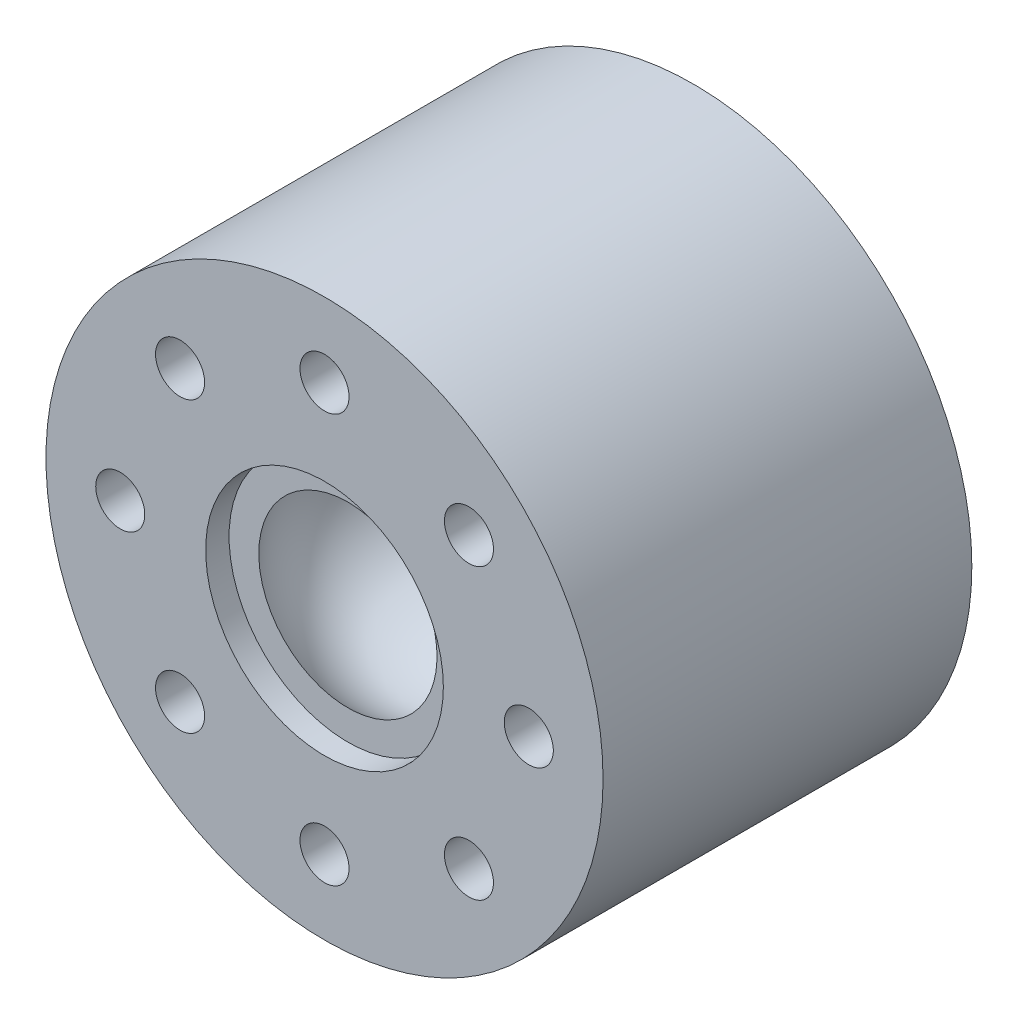
ISO-10303-21;
HEADER;
FILE_DESCRIPTION(('STEP AP214'),'2;1');
FILE_NAME('part.step','',(''),(''),'','','');
FILE_SCHEMA(('AUTOMOTIVE_DESIGN { 1 0 10303 214 1 1 1 1 }'));
ENDSEC;
DATA;
#1=APPLICATION_CONTEXT('core data for automotive mechanical design processes');
#2=APPLICATION_PROTOCOL_DEFINITION('international standard','automotive_design',2000,#1);
#3=PRODUCT_CONTEXT('',#1,'mechanical');
#4=PRODUCT('Part','Part','',(#3));
#5=PRODUCT_RELATED_PRODUCT_CATEGORY('part','',(#4));
#6=PRODUCT_DEFINITION_FORMATION('','',#4);
#7=PRODUCT_DEFINITION_CONTEXT('part definition',#1,'design');
#8=PRODUCT_DEFINITION('design','',#6,#7);
#9=PRODUCT_DEFINITION_SHAPE('','',#8);
#10=(LENGTH_UNIT() NAMED_UNIT(*) SI_UNIT(.MILLI.,.METRE.));
#11=(NAMED_UNIT(*) PLANE_ANGLE_UNIT() SI_UNIT($,.RADIAN.));
#12=(NAMED_UNIT(*) SI_UNIT($,.STERADIAN.) SOLID_ANGLE_UNIT());
#13=UNCERTAINTY_MEASURE_WITH_UNIT(LENGTH_MEASURE(1.E-05),#10,'distance_accuracy_value','');
#14=(GEOMETRIC_REPRESENTATION_CONTEXT(3) GLOBAL_UNCERTAINTY_ASSIGNED_CONTEXT((#13)) GLOBAL_UNIT_ASSIGNED_CONTEXT((#10,
#11,#12)) REPRESENTATION_CONTEXT('',''));
#15=CARTESIAN_POINT('',(0.,0.,0.));
#16=DIRECTION('',(0.,0.,1.));
#17=DIRECTION('',(1.,0.,0.));
#18=AXIS2_PLACEMENT_3D('',#15,#16,#17);
#19=CARTESIAN_POINT('',(0.,0.,-10.));
#20=DIRECTION('',(0.,0.,1.));
#21=DIRECTION('',(1.,0.,0.));
#22=AXIS2_PLACEMENT_3D('',#19,#20,#21);
#23=CYLINDRICAL_SURFACE('',#22,37.5);
#24=CARTESIAN_POINT('',(0.,0.,-10.));
#25=DIRECTION('',(0.,0.,1.));
#26=DIRECTION('',(1.,0.,0.));
#27=AXIS2_PLACEMENT_3D('',#24,#25,#26);
#28=CIRCLE('',#27,37.5);
#29=CARTESIAN_POINT('',(37.5,0.,-10.));
#30=VERTEX_POINT('',#29);
#31=EDGE_CURVE('E10',#30,#30,#28,.T.);
#32=ORIENTED_EDGE('',*,*,#31,.T.);
#33=EDGE_LOOP('',(#32));
#34=FACE_BOUND('',#33,.T.);
#35=CARTESIAN_POINT('',(0.,0.,39.65));
#36=DIRECTION('',(0.,0.,1.));
#37=DIRECTION('',(1.,0.,0.));
#38=AXIS2_PLACEMENT_3D('',#35,#36,#37);
#39=CIRCLE('',#38,37.5);
#40=CARTESIAN_POINT('',(37.5,0.,39.65));
#41=VERTEX_POINT('',#40);
#42=EDGE_CURVE('E123',#41,#41,#39,.T.);
#43=ORIENTED_EDGE('',*,*,#42,.F.);
#44=EDGE_LOOP('',(#43));
#45=FACE_BOUND('',#44,.T.);
#46=ADVANCED_FACE('F36',(#34,#45),#23,.T.);
#47=CARTESIAN_POINT('',(0.,0.,-10.));
#48=DIRECTION('',(0.,0.,1.));
#49=DIRECTION('',(1.,0.,0.));
#50=AXIS2_PLACEMENT_3D('',#47,#48,#49);
#51=PLANE('',#50);
#52=CARTESIAN_POINT('',(-27.5,0.,-10.));
#53=DIRECTION('',(0.,0.,-1.));
#54=DIRECTION('',(-1.,0.,0.));
#55=AXIS2_PLACEMENT_3D('',#52,#53,#54);
#56=CIRCLE('',#55,3.302);
#57=CARTESIAN_POINT('',(-30.802,0.,-10.));
#58=VERTEX_POINT('',#57);
#59=EDGE_CURVE('E89',#58,#58,#56,.T.);
#60=ORIENTED_EDGE('',*,*,#59,.F.);
#61=EDGE_LOOP('',(#60));
#62=FACE_BOUND('',#61,.T.);
#63=CARTESIAN_POINT('',(-19.4454364826301,-19.4454364826301,-10.));
#64=DIRECTION('',(0.,0.,-1.));
#65=DIRECTION('',(-1.,0.,0.));
#66=AXIS2_PLACEMENT_3D('',#63,#64,#65);
#67=CIRCLE('',#66,3.302);
#68=CARTESIAN_POINT('',(-22.7474364826301,-19.4454364826301,-10.));
#69=VERTEX_POINT('',#68);
#70=EDGE_CURVE('E93',#69,#69,#67,.T.);
#71=ORIENTED_EDGE('',*,*,#70,.F.);
#72=EDGE_LOOP('',(#71));
#73=FACE_BOUND('',#72,.T.);
#74=CARTESIAN_POINT('',(0.,-27.5,-10.));
#75=DIRECTION('',(0.,0.,-1.));
#76=DIRECTION('',(-1.,0.,0.));
#77=AXIS2_PLACEMENT_3D('',#74,#75,#76);
#78=CIRCLE('',#77,3.302);
#79=CARTESIAN_POINT('',(-3.302,-27.5,-10.));
#80=VERTEX_POINT('',#79);
#81=EDGE_CURVE('E97',#80,#80,#78,.T.);
#82=ORIENTED_EDGE('',*,*,#81,.F.);
#83=EDGE_LOOP('',(#82));
#84=FACE_BOUND('',#83,.T.);
#85=CARTESIAN_POINT('',(19.4454364826301,-19.4454364826301,-10.));
#86=DIRECTION('',(0.,0.,-1.));
#87=DIRECTION('',(-1.,0.,0.));
#88=AXIS2_PLACEMENT_3D('',#85,#86,#87);
#89=CIRCLE('',#88,3.302);
#90=CARTESIAN_POINT('',(16.1434364826301,-19.4454364826301,-10.));
#91=VERTEX_POINT('',#90);
#92=EDGE_CURVE('E101',#91,#91,#89,.T.);
#93=ORIENTED_EDGE('',*,*,#92,.F.);
#94=EDGE_LOOP('',(#93));
#95=FACE_BOUND('',#94,.T.);
#96=CARTESIAN_POINT('',(27.5,0.,-10.));
#97=DIRECTION('',(0.,0.,-1.));
#98=DIRECTION('',(-1.,0.,0.));
#99=AXIS2_PLACEMENT_3D('',#96,#97,#98);
#100=CIRCLE('',#99,3.302);
#101=CARTESIAN_POINT('',(24.198,0.,-10.));
#102=VERTEX_POINT('',#101);
#103=EDGE_CURVE('E105',#102,#102,#100,.T.);
#104=ORIENTED_EDGE('',*,*,#103,.F.);
#105=EDGE_LOOP('',(#104));
#106=FACE_BOUND('',#105,.T.);
#107=CARTESIAN_POINT('',(19.4454364826301,19.4454364826301,-10.));
#108=DIRECTION('',(0.,0.,-1.));
#109=DIRECTION('',(-1.,0.,0.));
#110=AXIS2_PLACEMENT_3D('',#107,#108,#109);
#111=CIRCLE('',#110,3.302);
#112=CARTESIAN_POINT('',(16.1434364826301,19.4454364826301,-10.));
#113=VERTEX_POINT('',#112);
#114=EDGE_CURVE('E109',#113,#113,#111,.T.);
#115=ORIENTED_EDGE('',*,*,#114,.F.);
#116=EDGE_LOOP('',(#115));
#117=FACE_BOUND('',#116,.T.);
#118=CARTESIAN_POINT('',(0.,27.5,-10.));
#119=DIRECTION('',(0.,0.,-1.));
#120=DIRECTION('',(-1.,0.,0.));
#121=AXIS2_PLACEMENT_3D('',#118,#119,#120);
#122=CIRCLE('',#121,3.302);
#123=CARTESIAN_POINT('',(-3.302,27.5,-10.));
#124=VERTEX_POINT('',#123);
#125=EDGE_CURVE('E113',#124,#124,#122,.T.);
#126=ORIENTED_EDGE('',*,*,#125,.F.);
#127=EDGE_LOOP('',(#126));
#128=FACE_BOUND('',#127,.T.);
#129=CARTESIAN_POINT('',(-19.4454364826301,19.4454364826301,-10.));
#130=DIRECTION('',(0.,0.,-1.));
#131=DIRECTION('',(-1.,0.,0.));
#132=AXIS2_PLACEMENT_3D('',#129,#130,#131);
#133=CIRCLE('',#132,3.302);
#134=CARTESIAN_POINT('',(-22.7474364826301,19.4454364826301,-10.));
#135=VERTEX_POINT('',#134);
#136=EDGE_CURVE('E117',#135,#135,#133,.T.);
#137=ORIENTED_EDGE('',*,*,#136,.F.);
#138=EDGE_LOOP('',(#137));
#139=FACE_BOUND('',#138,.T.);
#140=CARTESIAN_POINT('',(0.,0.,-10.));
#141=DIRECTION('',(0.,0.,-1.));
#142=DIRECTION('',(-1.,0.,0.));
#143=AXIS2_PLACEMENT_3D('',#140,#141,#142);
#144=CIRCLE('',#143,8.9296875);
#145=CARTESIAN_POINT('',(-8.9296875,0.,-10.));
#146=VERTEX_POINT('',#145);
#147=EDGE_CURVE('E52',#146,#146,#144,.T.);
#148=ORIENTED_EDGE('',*,*,#147,.F.);
#149=EDGE_LOOP('',(#148));
#150=FACE_BOUND('',#149,.T.);
#151=ORIENTED_EDGE('',*,*,#31,.F.);
#152=EDGE_LOOP('',(#151));
#153=FACE_BOUND('',#152,.T.);
#154=ADVANCED_FACE('F78',(#62,#73,#84,#95,#106,#117,#128,#139,#150,#153),#51,.F.);
#155=CARTESIAN_POINT('',(0.,0.,13.));
#156=DIRECTION('',(0.,0.,-1.));
#157=DIRECTION('',(-1.,0.,0.));
#158=AXIS2_PLACEMENT_3D('',#155,#156,#157);
#159=CYLINDRICAL_SURFACE('',#158,8.9296875);
#160=CARTESIAN_POINT('',(0.,0.,13.));
#161=DIRECTION('',(0.,0.,1.));
#162=DIRECTION('',(1.,0.,0.));
#163=AXIS2_PLACEMENT_3D('',#160,#161,#162);
#164=CIRCLE('',#163,8.9296875);
#165=CARTESIAN_POINT('',(8.9296875,0.,13.));
#166=VERTEX_POINT('',#165);
#167=EDGE_CURVE('E135',#166,#166,#164,.T.);
#168=ORIENTED_EDGE('',*,*,#167,.T.);
#169=EDGE_LOOP('',(#168));
#170=FACE_BOUND('',#169,.T.);
#171=ORIENTED_EDGE('',*,*,#147,.T.);
#172=EDGE_LOOP('',(#171));
#173=FACE_BOUND('',#172,.T.);
#174=ADVANCED_FACE('F69',(#170,#173),#159,.F.);
#175=CARTESIAN_POINT('',(0.,0.,39.65));
#176=DIRECTION('',(0.,0.,1.));
#177=DIRECTION('',(1.,0.,0.));
#178=AXIS2_PLACEMENT_3D('',#175,#176,#177);
#179=PLANE('',#178);
#180=CARTESIAN_POINT('',(-27.5,0.,39.65));
#181=DIRECTION('',(0.,0.,-1.));
#182=DIRECTION('',(-1.,0.,0.));
#183=AXIS2_PLACEMENT_3D('',#180,#181,#182);
#184=CIRCLE('',#183,3.302);
#185=CARTESIAN_POINT('',(-30.802,0.,39.65));
#186=VERTEX_POINT('',#185);
#187=EDGE_CURVE('E127',#186,#186,#184,.T.);
#188=ORIENTED_EDGE('',*,*,#187,.T.);
#189=EDGE_LOOP('',(#188));
#190=FACE_BOUND('',#189,.T.);
#191=CARTESIAN_POINT('',(-19.4454364826301,-19.4454364826301,39.65));
#192=DIRECTION('',(0.,0.,-1.));
#193=DIRECTION('',(-1.,0.,0.));
#194=AXIS2_PLACEMENT_3D('',#191,#192,#193);
#195=CIRCLE('',#194,3.302);
#196=CARTESIAN_POINT('',(-22.7474364826301,-19.4454364826301,39.65));
#197=VERTEX_POINT('',#196);
#198=EDGE_CURVE('E159',#197,#197,#195,.T.);
#199=ORIENTED_EDGE('',*,*,#198,.T.);
#200=EDGE_LOOP('',(#199));
#201=FACE_BOUND('',#200,.T.);
#202=CARTESIAN_POINT('',(0.,-27.5,39.65));
#203=DIRECTION('',(0.,0.,-1.));
#204=DIRECTION('',(-1.,0.,0.));
#205=AXIS2_PLACEMENT_3D('',#202,#203,#204);
#206=CIRCLE('',#205,3.302);
#207=CARTESIAN_POINT('',(-3.302,-27.5,39.65));
#208=VERTEX_POINT('',#207);
#209=EDGE_CURVE('E155',#208,#208,#206,.T.);
#210=ORIENTED_EDGE('',*,*,#209,.T.);
#211=EDGE_LOOP('',(#210));
#212=FACE_BOUND('',#211,.T.);
#213=CARTESIAN_POINT('',(19.4454364826301,-19.4454364826301,39.65));
#214=DIRECTION('',(0.,0.,-1.));
#215=DIRECTION('',(-1.,0.,0.));
#216=AXIS2_PLACEMENT_3D('',#213,#214,#215);
#217=CIRCLE('',#216,3.302);
#218=CARTESIAN_POINT('',(16.1434364826301,-19.4454364826301,39.65));
#219=VERTEX_POINT('',#218);
#220=EDGE_CURVE('E151',#219,#219,#217,.T.);
#221=ORIENTED_EDGE('',*,*,#220,.T.);
#222=EDGE_LOOP('',(#221));
#223=FACE_BOUND('',#222,.T.);
#224=CARTESIAN_POINT('',(27.5,0.,39.65));
#225=DIRECTION('',(0.,0.,-1.));
#226=DIRECTION('',(-1.,0.,0.));
#227=AXIS2_PLACEMENT_3D('',#224,#225,#226);
#228=CIRCLE('',#227,3.302);
#229=CARTESIAN_POINT('',(24.198,0.,39.65));
#230=VERTEX_POINT('',#229);
#231=EDGE_CURVE('E147',#230,#230,#228,.T.);
#232=ORIENTED_EDGE('',*,*,#231,.T.);
#233=EDGE_LOOP('',(#232));
#234=FACE_BOUND('',#233,.T.);
#235=CARTESIAN_POINT('',(19.4454364826301,19.4454364826301,39.65));
#236=DIRECTION('',(0.,0.,-1.));
#237=DIRECTION('',(-1.,0.,0.));
#238=AXIS2_PLACEMENT_3D('',#235,#236,#237);
#239=CIRCLE('',#238,3.302);
#240=CARTESIAN_POINT('',(16.1434364826301,19.4454364826301,39.65));
#241=VERTEX_POINT('',#240);
#242=EDGE_CURVE('E143',#241,#241,#239,.T.);
#243=ORIENTED_EDGE('',*,*,#242,.T.);
#244=EDGE_LOOP('',(#243));
#245=FACE_BOUND('',#244,.T.);
#246=CARTESIAN_POINT('',(0.,27.5,39.65));
#247=DIRECTION('',(0.,0.,-1.));
#248=DIRECTION('',(-1.,0.,0.));
#249=AXIS2_PLACEMENT_3D('',#246,#247,#248);
#250=CIRCLE('',#249,3.302);
#251=CARTESIAN_POINT('',(-3.302,27.5,39.65));
#252=VERTEX_POINT('',#251);
#253=EDGE_CURVE('E139',#252,#252,#250,.T.);
#254=ORIENTED_EDGE('',*,*,#253,.T.);
#255=EDGE_LOOP('',(#254));
#256=FACE_BOUND('',#255,.T.);
#257=CARTESIAN_POINT('',(-19.4454364826301,19.4454364826301,39.65));
#258=DIRECTION('',(0.,0.,-1.));
#259=DIRECTION('',(-1.,0.,0.));
#260=AXIS2_PLACEMENT_3D('',#257,#258,#259);
#261=CIRCLE('',#260,3.302);
#262=CARTESIAN_POINT('',(-22.7474364826301,19.4454364826301,39.65));
#263=VERTEX_POINT('',#262);
#264=EDGE_CURVE('E134',#263,#263,#261,.T.);
#265=ORIENTED_EDGE('',*,*,#264,.T.);
#266=EDGE_LOOP('',(#265));
#267=FACE_BOUND('',#266,.T.);
#268=ORIENTED_EDGE('',*,*,#42,.T.);
#269=EDGE_LOOP('',(#268));
#270=FACE_BOUND('',#269,.T.);
#271=CARTESIAN_POINT('',(0.,0.,39.65));
#272=DIRECTION('',(0.,0.,1.));
#273=DIRECTION('',(1.,0.,0.));
#274=AXIS2_PLACEMENT_3D('',#271,#272,#273);
#275=CIRCLE('',#274,16.);
#276=CARTESIAN_POINT('',(16.,0.,39.65));
#277=VERTEX_POINT('',#276);
#278=EDGE_CURVE('E39',#277,#277,#275,.F.);
#279=ORIENTED_EDGE('',*,*,#278,.T.);
#280=EDGE_LOOP('',(#279));
#281=FACE_BOUND('',#280,.T.);
#282=ADVANCED_FACE('F67',(#190,#201,#212,#223,#234,#245,#256,#267,#270,#281),#179,.T.);
#283=CARTESIAN_POINT('',(0.,12.,19.46));
#284=CARTESIAN_POINT('',(0.,19.4407666713102,27.9470185247781));
#285=CARTESIAN_POINT('',(0.,12.,36.5));
#286=B_SPLINE_CURVE_WITH_KNOTS('',2,(#283,#284,#285),.UNSPECIFIED.,.F.,.F.,(3,3),(0.,1.),.UNSPECIFIED.);
#287=CARTESIAN_POINT('',(0.,0.,19.46));
#288=DIRECTION('',(0.,0.,-1.));
#289=AXIS1_PLACEMENT('',#287,#288);
#290=SURFACE_OF_REVOLUTION('',#286,#289);
#291=CARTESIAN_POINT('',(0.,0.,36.5));
#292=DIRECTION('',(0.,0.,-1.));
#293=DIRECTION('',(0.,1.,0.));
#294=AXIS2_PLACEMENT_3D('',#291,#292,#293);
#295=CIRCLE('',#294,12.);
#296=CARTESIAN_POINT('',(0.,12.,36.5));
#297=VERTEX_POINT('',#296);
#298=EDGE_CURVE('E47',#297,#297,#295,.T.);
#299=ORIENTED_EDGE('',*,*,#298,.F.);
#300=EDGE_LOOP('',(#299));
#301=FACE_BOUND('',#300,.T.);
#302=CARTESIAN_POINT('',(0.,0.,19.46));
#303=DIRECTION('',(0.,0.,1.));
#304=DIRECTION('',(1.,0.,0.));
#305=AXIS2_PLACEMENT_3D('',#302,#303,#304);
#306=CIRCLE('',#305,12.);
#307=CARTESIAN_POINT('',(12.,0.,19.46));
#308=VERTEX_POINT('',#307);
#309=EDGE_CURVE('E165',#308,#308,#306,.T.);
#310=ORIENTED_EDGE('',*,*,#309,.F.);
#311=EDGE_LOOP('',(#310));
#312=FACE_BOUND('',#311,.T.);
#313=ADVANCED_FACE('F62',(#301,#312),#290,.T.);
#314=CARTESIAN_POINT('',(0.,0.,36.5));
#315=DIRECTION('',(0.,0.,1.));
#316=DIRECTION('',(1.,0.,0.));
#317=AXIS2_PLACEMENT_3D('',#314,#315,#316);
#318=PLANE('',#317);
#319=ORIENTED_EDGE('',*,*,#298,.T.);
#320=EDGE_LOOP('',(#319));
#321=FACE_BOUND('',#320,.T.);
#322=CARTESIAN_POINT('',(0.,0.,36.5));
#323=DIRECTION('',(0.,0.,1.));
#324=DIRECTION('',(1.,0.,0.));
#325=AXIS2_PLACEMENT_3D('',#322,#323,#324);
#326=CIRCLE('',#325,16.);
#327=CARTESIAN_POINT('',(16.,0.,36.5));
#328=VERTEX_POINT('',#327);
#329=EDGE_CURVE('E43',#328,#328,#326,.T.);
#330=ORIENTED_EDGE('',*,*,#329,.T.);
#331=EDGE_LOOP('',(#330));
#332=FACE_BOUND('',#331,.T.);
#333=ADVANCED_FACE('F66',(#321,#332),#318,.T.);
#334=CARTESIAN_POINT('',(0.,0.,39.));
#335=DIRECTION('',(0.,0.,1.));
#336=DIRECTION('',(1.,0.,0.));
#337=AXIS2_PLACEMENT_3D('',#334,#335,#336);
#338=CYLINDRICAL_SURFACE('',#337,16.);
#339=ORIENTED_EDGE('',*,*,#329,.F.);
#340=EDGE_LOOP('',(#339));
#341=FACE_BOUND('',#340,.T.);
#342=ORIENTED_EDGE('',*,*,#278,.F.);
#343=EDGE_LOOP('',(#342));
#344=FACE_BOUND('',#343,.T.);
#345=ADVANCED_FACE('F73',(#341,#344),#338,.F.);
#346=CARTESIAN_POINT('',(-19.4454364826301,19.4454364826301,39.65));
#347=DIRECTION('',(0.,0.,-1.));
#348=DIRECTION('',(-1.,0.,0.));
#349=AXIS2_PLACEMENT_3D('',#346,#347,#348);
#350=CYLINDRICAL_SURFACE('',#349,3.302);
#351=ORIENTED_EDGE('',*,*,#264,.F.);
#352=EDGE_LOOP('',(#351));
#353=FACE_BOUND('',#352,.T.);
#354=ORIENTED_EDGE('',*,*,#136,.T.);
#355=EDGE_LOOP('',(#354));
#356=FACE_BOUND('',#355,.T.);
#357=ADVANCED_FACE('F76',(#353,#356),#350,.F.);
#358=CARTESIAN_POINT('',(0.,27.5,39.65));
#359=DIRECTION('',(0.,0.,-1.));
#360=DIRECTION('',(-1.,0.,0.));
#361=AXIS2_PLACEMENT_3D('',#358,#359,#360);
#362=CYLINDRICAL_SURFACE('',#361,3.302);
#363=ORIENTED_EDGE('',*,*,#253,.F.);
#364=EDGE_LOOP('',(#363));
#365=FACE_BOUND('',#364,.T.);
#366=ORIENTED_EDGE('',*,*,#125,.T.);
#367=EDGE_LOOP('',(#366));
#368=FACE_BOUND('',#367,.T.);
#369=ADVANCED_FACE('F201',(#365,#368),#362,.F.);
#370=CARTESIAN_POINT('',(19.4454364826301,19.4454364826301,39.65));
#371=DIRECTION('',(0.,0.,-1.));
#372=DIRECTION('',(-1.,0.,0.));
#373=AXIS2_PLACEMENT_3D('',#370,#371,#372);
#374=CYLINDRICAL_SURFACE('',#373,3.302);
#375=ORIENTED_EDGE('',*,*,#242,.F.);
#376=EDGE_LOOP('',(#375));
#377=FACE_BOUND('',#376,.T.);
#378=ORIENTED_EDGE('',*,*,#114,.T.);
#379=EDGE_LOOP('',(#378));
#380=FACE_BOUND('',#379,.T.);
#381=ADVANCED_FACE('F197',(#377,#380),#374,.F.);
#382=CARTESIAN_POINT('',(27.5,0.,39.65));
#383=DIRECTION('',(0.,0.,-1.));
#384=DIRECTION('',(-1.,0.,0.));
#385=AXIS2_PLACEMENT_3D('',#382,#383,#384);
#386=CYLINDRICAL_SURFACE('',#385,3.302);
#387=ORIENTED_EDGE('',*,*,#231,.F.);
#388=EDGE_LOOP('',(#387));
#389=FACE_BOUND('',#388,.T.);
#390=ORIENTED_EDGE('',*,*,#103,.T.);
#391=EDGE_LOOP('',(#390));
#392=FACE_BOUND('',#391,.T.);
#393=ADVANCED_FACE('F193',(#389,#392),#386,.F.);
#394=CARTESIAN_POINT('',(19.4454364826301,-19.4454364826301,39.65));
#395=DIRECTION('',(0.,0.,-1.));
#396=DIRECTION('',(-1.,0.,0.));
#397=AXIS2_PLACEMENT_3D('',#394,#395,#396);
#398=CYLINDRICAL_SURFACE('',#397,3.302);
#399=ORIENTED_EDGE('',*,*,#220,.F.);
#400=EDGE_LOOP('',(#399));
#401=FACE_BOUND('',#400,.T.);
#402=ORIENTED_EDGE('',*,*,#92,.T.);
#403=EDGE_LOOP('',(#402));
#404=FACE_BOUND('',#403,.T.);
#405=ADVANCED_FACE('F189',(#401,#404),#398,.F.);
#406=CARTESIAN_POINT('',(0.,-27.5,39.65));
#407=DIRECTION('',(0.,0.,-1.));
#408=DIRECTION('',(-1.,0.,0.));
#409=AXIS2_PLACEMENT_3D('',#406,#407,#408);
#410=CYLINDRICAL_SURFACE('',#409,3.302);
#411=ORIENTED_EDGE('',*,*,#209,.F.);
#412=EDGE_LOOP('',(#411));
#413=FACE_BOUND('',#412,.T.);
#414=ORIENTED_EDGE('',*,*,#81,.T.);
#415=EDGE_LOOP('',(#414));
#416=FACE_BOUND('',#415,.T.);
#417=ADVANCED_FACE('F185',(#413,#416),#410,.F.);
#418=CARTESIAN_POINT('',(-19.4454364826301,-19.4454364826301,39.65));
#419=DIRECTION('',(0.,0.,-1.));
#420=DIRECTION('',(-1.,0.,0.));
#421=AXIS2_PLACEMENT_3D('',#418,#419,#420);
#422=CYLINDRICAL_SURFACE('',#421,3.302);
#423=ORIENTED_EDGE('',*,*,#198,.F.);
#424=EDGE_LOOP('',(#423));
#425=FACE_BOUND('',#424,.T.);
#426=ORIENTED_EDGE('',*,*,#70,.T.);
#427=EDGE_LOOP('',(#426));
#428=FACE_BOUND('',#427,.T.);
#429=ADVANCED_FACE('F178',(#425,#428),#422,.F.);
#430=CARTESIAN_POINT('',(-27.5,0.,39.65));
#431=DIRECTION('',(0.,0.,-1.));
#432=DIRECTION('',(-1.,0.,0.));
#433=AXIS2_PLACEMENT_3D('',#430,#431,#432);
#434=CYLINDRICAL_SURFACE('',#433,3.302);
#435=ORIENTED_EDGE('',*,*,#187,.F.);
#436=EDGE_LOOP('',(#435));
#437=FACE_BOUND('',#436,.T.);
#438=ORIENTED_EDGE('',*,*,#59,.T.);
#439=EDGE_LOOP('',(#438));
#440=FACE_BOUND('',#439,.T.);
#441=ADVANCED_FACE('F172',(#437,#440),#434,.F.);
#442=CARTESIAN_POINT('',(0.,0.,19.46));
#443=DIRECTION('',(0.,0.,1.));
#444=DIRECTION('',(1.,0.,0.));
#445=AXIS2_PLACEMENT_3D('',#442,#443,#444);
#446=CONICAL_SURFACE('',#445,12.,0.443677233712878);
#447=ORIENTED_EDGE('',*,*,#167,.F.);
#448=EDGE_LOOP('',(#447));
#449=FACE_BOUND('',#448,.T.);
#450=ORIENTED_EDGE('',*,*,#309,.T.);
#451=EDGE_LOOP('',(#450));
#452=FACE_BOUND('',#451,.T.);
#453=ADVANCED_FACE('F169',(#449,#452),#446,.F.);
#454=CLOSED_SHELL('',(#46,#154,#174,#282,#313,#333,#345,#357,#369,#381,#393,#405,#417,#429,#441,#453));
#455=MANIFOLD_SOLID_BREP('B2',#454);
#456=ADVANCED_BREP_SHAPE_REPRESENTATION('',(#18,#455),#14);
#457=SHAPE_DEFINITION_REPRESENTATION(#9,#456);
ENDSEC;
END-ISO-10303-21;
